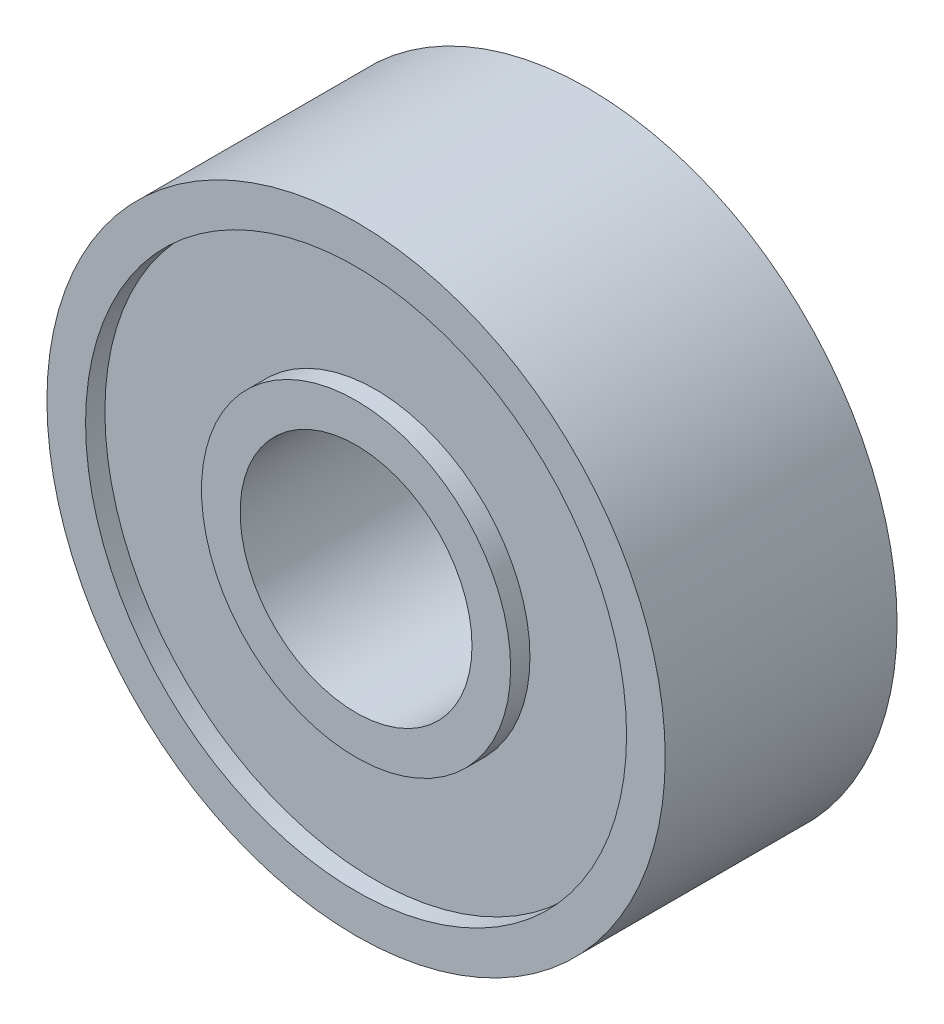
ISO-10303-21;
HEADER;
FILE_DESCRIPTION(('STEP AP214'),'2;1');
FILE_NAME('part.step','',(''),(''),'','','');
FILE_SCHEMA(('AUTOMOTIVE_DESIGN { 1 0 10303 214 1 1 1 1 }'));
ENDSEC;
DATA;
#1=APPLICATION_CONTEXT('core data for automotive mechanical design processes');
#2=APPLICATION_PROTOCOL_DEFINITION('international standard','automotive_design',2000,#1);
#3=PRODUCT_CONTEXT('',#1,'mechanical');
#4=PRODUCT('Part','Part','',(#3));
#5=PRODUCT_RELATED_PRODUCT_CATEGORY('part','',(#4));
#6=PRODUCT_DEFINITION_FORMATION('','',#4);
#7=PRODUCT_DEFINITION_CONTEXT('part definition',#1,'design');
#8=PRODUCT_DEFINITION('design','',#6,#7);
#9=PRODUCT_DEFINITION_SHAPE('','',#8);
#10=(LENGTH_UNIT() NAMED_UNIT(*) SI_UNIT(.MILLI.,.METRE.));
#11=(NAMED_UNIT(*) PLANE_ANGLE_UNIT() SI_UNIT($,.RADIAN.));
#12=(NAMED_UNIT(*) SI_UNIT($,.STERADIAN.) SOLID_ANGLE_UNIT());
#13=UNCERTAINTY_MEASURE_WITH_UNIT(LENGTH_MEASURE(1.E-05),#10,'distance_accuracy_value','');
#14=(GEOMETRIC_REPRESENTATION_CONTEXT(3) GLOBAL_UNCERTAINTY_ASSIGNED_CONTEXT((#13)) GLOBAL_UNIT_ASSIGNED_CONTEXT((#10,
#11,#12)) REPRESENTATION_CONTEXT('',''));
#15=CARTESIAN_POINT('',(0.,0.,0.));
#16=DIRECTION('',(0.,0.,1.));
#17=DIRECTION('',(1.,0.,0.));
#18=AXIS2_PLACEMENT_3D('',#15,#16,#17);
#19=CARTESIAN_POINT('',(0.,0.,-3.));
#20=DIRECTION('',(0.,0.,1.));
#21=DIRECTION('',(1.,0.,0.));
#22=AXIS2_PLACEMENT_3D('',#19,#20,#21);
#23=PLANE('',#22);
#24=CARTESIAN_POINT('',(0.,0.,-3.));
#25=DIRECTION('',(0.,0.,1.));
#26=DIRECTION('',(1.,0.,0.));
#27=AXIS2_PLACEMENT_3D('',#24,#25,#26);
#28=CIRCLE('',#27,3.);
#29=CARTESIAN_POINT('',(3.,0.,-3.));
#30=VERTEX_POINT('',#29);
#31=EDGE_CURVE('E52',#30,#30,#28,.T.);
#32=ORIENTED_EDGE('',*,*,#31,.T.);
#33=EDGE_LOOP('',(#32));
#34=FACE_BOUND('',#33,.T.);
#35=CARTESIAN_POINT('',(0.,0.,-3.));
#36=DIRECTION('',(0.,0.,1.));
#37=DIRECTION('',(1.,0.,0.));
#38=AXIS2_PLACEMENT_3D('',#35,#36,#37);
#39=CIRCLE('',#38,4.);
#40=CARTESIAN_POINT('',(4.,0.,-3.));
#41=VERTEX_POINT('',#40);
#42=EDGE_CURVE('E76',#41,#41,#39,.T.);
#43=ORIENTED_EDGE('',*,*,#42,.F.);
#44=EDGE_LOOP('',(#43));
#45=FACE_BOUND('',#44,.T.);
#46=ADVANCED_FACE('F39',(#34,#45),#23,.F.);
#47=CARTESIAN_POINT('',(0.,0.,3.));
#48=DIRECTION('',(0.,0.,1.));
#49=DIRECTION('',(1.,0.,0.));
#50=AXIS2_PLACEMENT_3D('',#47,#48,#49);
#51=PLANE('',#50);
#52=CARTESIAN_POINT('',(0.,0.,3.));
#53=DIRECTION('',(0.,0.,1.));
#54=DIRECTION('',(1.,0.,0.));
#55=AXIS2_PLACEMENT_3D('',#52,#53,#54);
#56=CIRCLE('',#55,3.);
#57=CARTESIAN_POINT('',(3.,0.,3.));
#58=VERTEX_POINT('',#57);
#59=EDGE_CURVE('E50',#58,#58,#56,.T.);
#60=ORIENTED_EDGE('',*,*,#59,.F.);
#61=EDGE_LOOP('',(#60));
#62=FACE_BOUND('',#61,.T.);
#63=CARTESIAN_POINT('',(0.,0.,3.));
#64=DIRECTION('',(0.,0.,1.));
#65=DIRECTION('',(1.,0.,0.));
#66=AXIS2_PLACEMENT_3D('',#63,#64,#65);
#67=CIRCLE('',#66,4.);
#68=CARTESIAN_POINT('',(4.,0.,3.));
#69=VERTEX_POINT('',#68);
#70=EDGE_CURVE('E64',#69,#69,#67,.T.);
#71=ORIENTED_EDGE('',*,*,#70,.T.);
#72=EDGE_LOOP('',(#71));
#73=FACE_BOUND('',#72,.T.);
#74=ADVANCED_FACE('F92',(#62,#73),#51,.T.);
#75=CARTESIAN_POINT('',(0.,0.,3.));
#76=DIRECTION('',(0.,0.,1.));
#77=DIRECTION('',(1.,0.,0.));
#78=AXIS2_PLACEMENT_3D('',#75,#76,#77);
#79=CIRCLE('',#78,7.);
#80=CARTESIAN_POINT('',(7.,0.,3.));
#81=VERTEX_POINT('',#80);
#82=EDGE_CURVE('E58',#81,#81,#79,.T.);
#83=ORIENTED_EDGE('',*,*,#82,.F.);
#84=EDGE_LOOP('',(#83));
#85=FACE_BOUND('',#84,.T.);
#86=CARTESIAN_POINT('',(0.,0.,3.));
#87=DIRECTION('',(0.,0.,1.));
#88=DIRECTION('',(1.,0.,0.));
#89=AXIS2_PLACEMENT_3D('',#86,#87,#88);
#90=CIRCLE('',#89,8.);
#91=CARTESIAN_POINT('',(8.,0.,3.));
#92=VERTEX_POINT('',#91);
#93=EDGE_CURVE('E10',#92,#92,#90,.T.);
#94=ORIENTED_EDGE('',*,*,#93,.T.);
#95=EDGE_LOOP('',(#94));
#96=FACE_BOUND('',#95,.T.);
#97=ADVANCED_FACE('F100',(#85,#96),#51,.T.);
#98=CARTESIAN_POINT('',(0.,0.,-3.));
#99=DIRECTION('',(0.,0.,1.));
#100=DIRECTION('',(1.,0.,0.));
#101=AXIS2_PLACEMENT_3D('',#98,#99,#100);
#102=CIRCLE('',#101,7.);
#103=CARTESIAN_POINT('',(7.,0.,-3.));
#104=VERTEX_POINT('',#103);
#105=EDGE_CURVE('E70',#104,#104,#102,.T.);
#106=ORIENTED_EDGE('',*,*,#105,.T.);
#107=EDGE_LOOP('',(#106));
#108=FACE_BOUND('',#107,.T.);
#109=CARTESIAN_POINT('',(0.,0.,-3.));
#110=DIRECTION('',(0.,0.,1.));
#111=DIRECTION('',(1.,0.,0.));
#112=AXIS2_PLACEMENT_3D('',#109,#110,#111);
#113=CIRCLE('',#112,8.);
#114=CARTESIAN_POINT('',(8.,0.,-3.));
#115=VERTEX_POINT('',#114);
#116=EDGE_CURVE('E43',#115,#115,#113,.T.);
#117=ORIENTED_EDGE('',*,*,#116,.F.);
#118=EDGE_LOOP('',(#117));
#119=FACE_BOUND('',#118,.T.);
#120=ADVANCED_FACE('F94',(#108,#119),#23,.F.);
#121=CARTESIAN_POINT('',(0.,0.,3.));
#122=DIRECTION('',(0.,0.,-1.));
#123=DIRECTION('',(-1.,0.,0.));
#124=AXIS2_PLACEMENT_3D('',#121,#122,#123);
#125=CYLINDRICAL_SURFACE('',#124,8.);
#126=ORIENTED_EDGE('',*,*,#93,.F.);
#127=EDGE_LOOP('',(#126));
#128=FACE_BOUND('',#127,.T.);
#129=ORIENTED_EDGE('',*,*,#116,.T.);
#130=EDGE_LOOP('',(#129));
#131=FACE_BOUND('',#130,.T.);
#132=ADVANCED_FACE('F41',(#128,#131),#125,.T.);
#133=CARTESIAN_POINT('',(0.,0.,3.));
#134=DIRECTION('',(0.,0.,-1.));
#135=DIRECTION('',(-1.,0.,0.));
#136=AXIS2_PLACEMENT_3D('',#133,#134,#135);
#137=CYLINDRICAL_SURFACE('',#136,3.);
#138=ORIENTED_EDGE('',*,*,#59,.T.);
#139=EDGE_LOOP('',(#138));
#140=FACE_BOUND('',#139,.T.);
#141=ORIENTED_EDGE('',*,*,#31,.F.);
#142=EDGE_LOOP('',(#141));
#143=FACE_BOUND('',#142,.T.);
#144=ADVANCED_FACE('F108',(#140,#143),#137,.F.);
#145=CARTESIAN_POINT('',(0.,0.,2.5));
#146=DIRECTION('',(0.,0.,1.));
#147=DIRECTION('',(1.,0.,0.));
#148=AXIS2_PLACEMENT_3D('',#145,#146,#147);
#149=CYLINDRICAL_SURFACE('',#148,7.);
#150=CARTESIAN_POINT('',(0.,0.,2.5));
#151=DIRECTION('',(0.,0.,1.));
#152=DIRECTION('',(1.,0.,0.));
#153=AXIS2_PLACEMENT_3D('',#150,#151,#152);
#154=CIRCLE('',#153,7.);
#155=CARTESIAN_POINT('',(7.,0.,2.5));
#156=VERTEX_POINT('',#155);
#157=EDGE_CURVE('E55',#156,#156,#154,.T.);
#158=ORIENTED_EDGE('',*,*,#157,.F.);
#159=EDGE_LOOP('',(#158));
#160=FACE_BOUND('',#159,.T.);
#161=ORIENTED_EDGE('',*,*,#82,.T.);
#162=EDGE_LOOP('',(#161));
#163=FACE_BOUND('',#162,.T.);
#164=ADVANCED_FACE('F131',(#160,#163),#149,.F.);
#165=CARTESIAN_POINT('',(0.,0.,2.5));
#166=DIRECTION('',(0.,0.,1.));
#167=DIRECTION('',(1.,0.,0.));
#168=AXIS2_PLACEMENT_3D('',#165,#166,#167);
#169=PLANE('',#168);
#170=CARTESIAN_POINT('',(0.,0.,2.5));
#171=DIRECTION('',(0.,0.,1.));
#172=DIRECTION('',(1.,0.,0.));
#173=AXIS2_PLACEMENT_3D('',#170,#171,#172);
#174=CIRCLE('',#173,4.);
#175=CARTESIAN_POINT('',(4.,0.,2.5));
#176=VERTEX_POINT('',#175);
#177=EDGE_CURVE('E61',#176,#176,#174,.T.);
#178=ORIENTED_EDGE('',*,*,#177,.F.);
#179=EDGE_LOOP('',(#178));
#180=FACE_BOUND('',#179,.T.);
#181=ORIENTED_EDGE('',*,*,#157,.T.);
#182=EDGE_LOOP('',(#181));
#183=FACE_BOUND('',#182,.T.);
#184=ADVANCED_FACE('F127',(#180,#183),#169,.T.);
#185=CARTESIAN_POINT('',(0.,0.,2.5));
#186=DIRECTION('',(0.,0.,1.));
#187=DIRECTION('',(1.,0.,0.));
#188=AXIS2_PLACEMENT_3D('',#185,#186,#187);
#189=CYLINDRICAL_SURFACE('',#188,4.);
#190=ORIENTED_EDGE('',*,*,#177,.T.);
#191=EDGE_LOOP('',(#190));
#192=FACE_BOUND('',#191,.T.);
#193=ORIENTED_EDGE('',*,*,#70,.F.);
#194=EDGE_LOOP('',(#193));
#195=FACE_BOUND('',#194,.T.);
#196=ADVANCED_FACE('F122',(#192,#195),#189,.T.);
#197=CARTESIAN_POINT('',(0.,0.,-2.5));
#198=DIRECTION('',(0.,0.,-1.));
#199=DIRECTION('',(1.,0.,0.));
#200=AXIS2_PLACEMENT_3D('',#197,#198,#199);
#201=PLANE('',#200);
#202=CARTESIAN_POINT('',(0.,0.,-2.5));
#203=DIRECTION('',(0.,0.,1.));
#204=DIRECTION('',(1.,0.,0.));
#205=AXIS2_PLACEMENT_3D('',#202,#203,#204);
#206=CIRCLE('',#205,7.);
#207=CARTESIAN_POINT('',(7.,0.,-2.5));
#208=VERTEX_POINT('',#207);
#209=EDGE_CURVE('E67',#208,#208,#206,.T.);
#210=ORIENTED_EDGE('',*,*,#209,.F.);
#211=EDGE_LOOP('',(#210));
#212=FACE_BOUND('',#211,.T.);
#213=CARTESIAN_POINT('',(0.,0.,-2.5));
#214=DIRECTION('',(0.,0.,1.));
#215=DIRECTION('',(1.,0.,0.));
#216=AXIS2_PLACEMENT_3D('',#213,#214,#215);
#217=CIRCLE('',#216,4.);
#218=CARTESIAN_POINT('',(4.,0.,-2.5));
#219=VERTEX_POINT('',#218);
#220=EDGE_CURVE('E73',#219,#219,#217,.T.);
#221=ORIENTED_EDGE('',*,*,#220,.T.);
#222=EDGE_LOOP('',(#221));
#223=FACE_BOUND('',#222,.T.);
#224=ADVANCED_FACE('F82',(#212,#223),#201,.T.);
#225=CARTESIAN_POINT('',(0.,0.,-2.5));
#226=DIRECTION('',(0.,0.,-1.));
#227=DIRECTION('',(-1.,0.,0.));
#228=AXIS2_PLACEMENT_3D('',#225,#226,#227);
#229=CYLINDRICAL_SURFACE('',#228,7.);
#230=ORIENTED_EDGE('',*,*,#209,.T.);
#231=EDGE_LOOP('',(#230));
#232=FACE_BOUND('',#231,.T.);
#233=ORIENTED_EDGE('',*,*,#105,.F.);
#234=EDGE_LOOP('',(#233));
#235=FACE_BOUND('',#234,.T.);
#236=ADVANCED_FACE('F87',(#232,#235),#229,.F.);
#237=CARTESIAN_POINT('',(0.,0.,-2.5));
#238=DIRECTION('',(0.,0.,-1.));
#239=DIRECTION('',(-1.,0.,0.));
#240=AXIS2_PLACEMENT_3D('',#237,#238,#239);
#241=CYLINDRICAL_SURFACE('',#240,4.);
#242=ORIENTED_EDGE('',*,*,#220,.F.);
#243=EDGE_LOOP('',(#242));
#244=FACE_BOUND('',#243,.T.);
#245=ORIENTED_EDGE('',*,*,#42,.T.);
#246=EDGE_LOOP('',(#245));
#247=FACE_BOUND('',#246,.T.);
#248=ADVANCED_FACE('F84',(#244,#247),#241,.T.);
#249=CLOSED_SHELL('',(#46,#74,#97,#120,#132,#144,#164,#184,#196,#224,#236,#248));
#250=MANIFOLD_SOLID_BREP('B2',#249);
#251=ADVANCED_BREP_SHAPE_REPRESENTATION('',(#18,#250),#14);
#252=SHAPE_DEFINITION_REPRESENTATION(#9,#251);
ENDSEC;
END-ISO-10303-21;
